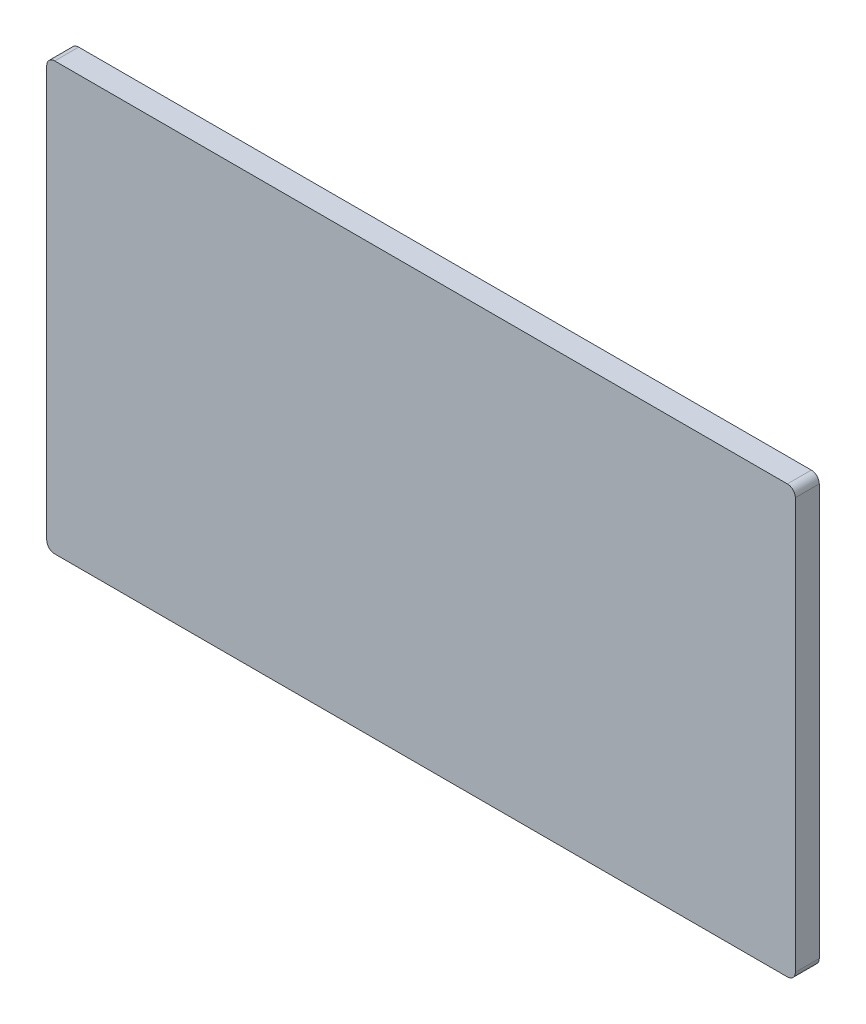
ISO-10303-21;
HEADER;
FILE_DESCRIPTION(('STEP AP214'),'2;1');
FILE_NAME('part.step','',(''),(''),'','','');
FILE_SCHEMA(('AUTOMOTIVE_DESIGN { 1 0 10303 214 1 1 1 1 }'));
ENDSEC;
DATA;
#1=APPLICATION_CONTEXT('core data for automotive mechanical design processes');
#2=APPLICATION_PROTOCOL_DEFINITION('international standard','automotive_design',2000,#1);
#3=PRODUCT_CONTEXT('',#1,'mechanical');
#4=PRODUCT('Part','Part','',(#3));
#5=PRODUCT_RELATED_PRODUCT_CATEGORY('part','',(#4));
#6=PRODUCT_DEFINITION_FORMATION('','',#4);
#7=PRODUCT_DEFINITION_CONTEXT('part definition',#1,'design');
#8=PRODUCT_DEFINITION('design','',#6,#7);
#9=PRODUCT_DEFINITION_SHAPE('','',#8);
#10=(LENGTH_UNIT() NAMED_UNIT(*) SI_UNIT(.MILLI.,.METRE.));
#11=(NAMED_UNIT(*) PLANE_ANGLE_UNIT() SI_UNIT($,.RADIAN.));
#12=(NAMED_UNIT(*) SI_UNIT($,.STERADIAN.) SOLID_ANGLE_UNIT());
#13=UNCERTAINTY_MEASURE_WITH_UNIT(LENGTH_MEASURE(1.E-05),#10,'distance_accuracy_value','');
#14=(GEOMETRIC_REPRESENTATION_CONTEXT(3) GLOBAL_UNCERTAINTY_ASSIGNED_CONTEXT((#13)) GLOBAL_UNIT_ASSIGNED_CONTEXT((#10,
#11,#12)) REPRESENTATION_CONTEXT('',''));
#15=CARTESIAN_POINT('',(0.,0.,0.));
#16=DIRECTION('',(0.,0.,1.));
#17=DIRECTION('',(1.,0.,0.));
#18=AXIS2_PLACEMENT_3D('',#15,#16,#17);
#19=CARTESIAN_POINT('',(46.9,26.75,3.));
#20=DIRECTION('',(-1.,0.,0.));
#21=DIRECTION('',(0.,0.,1.));
#22=AXIS2_PLACEMENT_3D('',#19,#20,#21);
#23=PLANE('',#22);
#24=DIRECTION('',(0.,1.,0.));
#25=VECTOR('',#24,1.);
#26=CARTESIAN_POINT('',(46.9,26.75,3.));
#27=LINE('',#26,#25);
#28=CARTESIAN_POINT('',(46.9,-25.75,3.));
#29=VERTEX_POINT('',#28);
#30=CARTESIAN_POINT('',(46.9,25.75,3.));
#31=VERTEX_POINT('',#30);
#32=EDGE_CURVE('E125',#29,#31,#27,.T.);
#33=ORIENTED_EDGE('',*,*,#32,.F.);
#34=DIRECTION('',(0.,0.,-1.));
#35=VECTOR('',#34,1.);
#36=CARTESIAN_POINT('',(46.9,-25.75,3.));
#37=LINE('',#36,#35);
#38=CARTESIAN_POINT('',(46.9,-25.75,0.));
#39=VERTEX_POINT('',#38);
#40=EDGE_CURVE('E151',#29,#39,#37,.T.);
#41=ORIENTED_EDGE('',*,*,#40,.T.);
#42=DIRECTION('',(0.,1.,0.));
#43=VECTOR('',#42,1.);
#44=CARTESIAN_POINT('',(46.9,26.75,0.));
#45=LINE('',#44,#43);
#46=CARTESIAN_POINT('',(46.9,25.75,0.));
#47=VERTEX_POINT('',#46);
#48=EDGE_CURVE('E157',#39,#47,#45,.T.);
#49=ORIENTED_EDGE('',*,*,#48,.T.);
#50=DIRECTION('',(0.,0.,-1.));
#51=VECTOR('',#50,1.);
#52=CARTESIAN_POINT('',(46.9,25.75,3.));
#53=LINE('',#52,#51);
#54=EDGE_CURVE('E149',#47,#31,#53,.F.);
#55=ORIENTED_EDGE('',*,*,#54,.T.);
#56=EDGE_LOOP('',(#33,#41,#49,#55));
#57=FACE_BOUND('',#56,.T.);
#58=ADVANCED_FACE('F33',(#57),#23,.F.);
#59=CARTESIAN_POINT('',(-46.9,26.75,3.));
#60=DIRECTION('',(0.,-1.,0.));
#61=DIRECTION('',(0.,0.,-1.));
#62=AXIS2_PLACEMENT_3D('',#59,#60,#61);
#63=PLANE('',#62);
#64=DIRECTION('',(-1.,0.,0.));
#65=VECTOR('',#64,1.);
#66=CARTESIAN_POINT('',(-46.9,26.75,3.));
#67=LINE('',#66,#65);
#68=CARTESIAN_POINT('',(45.9,26.75,3.));
#69=VERTEX_POINT('',#68);
#70=CARTESIAN_POINT('',(-45.9,26.75,3.));
#71=VERTEX_POINT('',#70);
#72=EDGE_CURVE('E128',#69,#71,#67,.T.);
#73=ORIENTED_EDGE('',*,*,#72,.F.);
#74=DIRECTION('',(0.,0.,-1.));
#75=VECTOR('',#74,1.);
#76=CARTESIAN_POINT('',(45.9,26.75,3.));
#77=LINE('',#76,#75);
#78=CARTESIAN_POINT('',(45.9,26.75,0.));
#79=VERTEX_POINT('',#78);
#80=EDGE_CURVE('E11',#69,#79,#77,.T.);
#81=ORIENTED_EDGE('',*,*,#80,.T.);
#82=DIRECTION('',(-1.,0.,0.));
#83=VECTOR('',#82,1.);
#84=CARTESIAN_POINT('',(-46.9,26.75,0.));
#85=LINE('',#84,#83);
#86=CARTESIAN_POINT('',(-45.9,26.75,0.));
#87=VERTEX_POINT('',#86);
#88=EDGE_CURVE('E130',#79,#87,#85,.T.);
#89=ORIENTED_EDGE('',*,*,#88,.T.);
#90=DIRECTION('',(0.,0.,-1.));
#91=VECTOR('',#90,1.);
#92=CARTESIAN_POINT('',(-45.9,26.75,3.));
#93=LINE('',#92,#91);
#94=EDGE_CURVE('E41',#87,#71,#93,.F.);
#95=ORIENTED_EDGE('',*,*,#94,.T.);
#96=EDGE_LOOP('',(#73,#81,#89,#95));
#97=FACE_BOUND('',#96,.T.);
#98=ADVANCED_FACE('F176',(#97),#63,.F.);
#99=CARTESIAN_POINT('',(-46.9,26.75,3.));
#100=DIRECTION('',(1.,0.,0.));
#101=DIRECTION('',(0.,0.,-1.));
#102=AXIS2_PLACEMENT_3D('',#99,#100,#101);
#103=PLANE('',#102);
#104=DIRECTION('',(0.,-1.,0.));
#105=VECTOR('',#104,1.);
#106=CARTESIAN_POINT('',(-46.9,26.75,0.));
#107=LINE('',#106,#105);
#108=CARTESIAN_POINT('',(-46.9,25.75,0.));
#109=VERTEX_POINT('',#108);
#110=CARTESIAN_POINT('',(-46.9,-25.75,0.));
#111=VERTEX_POINT('',#110);
#112=EDGE_CURVE('E126',#109,#111,#107,.T.);
#113=ORIENTED_EDGE('',*,*,#112,.T.);
#114=DIRECTION('',(0.,0.,-1.));
#115=VECTOR('',#114,1.);
#116=CARTESIAN_POINT('',(-46.9,-25.75,3.));
#117=LINE('',#116,#115);
#118=CARTESIAN_POINT('',(-46.9,-25.75,3.));
#119=VERTEX_POINT('',#118);
#120=EDGE_CURVE('E104',#111,#119,#117,.F.);
#121=ORIENTED_EDGE('',*,*,#120,.T.);
#122=DIRECTION('',(0.,-1.,0.));
#123=VECTOR('',#122,1.);
#124=CARTESIAN_POINT('',(-46.9,26.75,3.));
#125=LINE('',#124,#123);
#126=CARTESIAN_POINT('',(-46.9,25.75,3.));
#127=VERTEX_POINT('',#126);
#128=EDGE_CURVE('E165',#127,#119,#125,.T.);
#129=ORIENTED_EDGE('',*,*,#128,.F.);
#130=DIRECTION('',(0.,0.,-1.));
#131=VECTOR('',#130,1.);
#132=CARTESIAN_POINT('',(-46.9,25.75,3.));
#133=LINE('',#132,#131);
#134=EDGE_CURVE('E109',#127,#109,#133,.T.);
#135=ORIENTED_EDGE('',*,*,#134,.T.);
#136=EDGE_LOOP('',(#113,#121,#129,#135));
#137=FACE_BOUND('',#136,.T.);
#138=ADVANCED_FACE('F175',(#137),#103,.F.);
#139=CARTESIAN_POINT('',(-46.9,-26.75,3.));
#140=DIRECTION('',(0.,1.,0.));
#141=DIRECTION('',(0.,0.,1.));
#142=AXIS2_PLACEMENT_3D('',#139,#140,#141);
#143=PLANE('',#142);
#144=DIRECTION('',(1.,0.,0.));
#145=VECTOR('',#144,1.);
#146=CARTESIAN_POINT('',(-46.9,-26.75,3.));
#147=LINE('',#146,#145);
#148=CARTESIAN_POINT('',(-45.9,-26.75,3.));
#149=VERTEX_POINT('',#148);
#150=CARTESIAN_POINT('',(45.9,-26.75,3.));
#151=VERTEX_POINT('',#150);
#152=EDGE_CURVE('E119',#149,#151,#147,.T.);
#153=ORIENTED_EDGE('',*,*,#152,.F.);
#154=DIRECTION('',(0.,0.,-1.));
#155=VECTOR('',#154,1.);
#156=CARTESIAN_POINT('',(-45.9,-26.75,3.));
#157=LINE('',#156,#155);
#158=CARTESIAN_POINT('',(-45.9,-26.75,0.));
#159=VERTEX_POINT('',#158);
#160=EDGE_CURVE('E103',#149,#159,#157,.T.);
#161=ORIENTED_EDGE('',*,*,#160,.T.);
#162=DIRECTION('',(1.,0.,0.));
#163=VECTOR('',#162,1.);
#164=CARTESIAN_POINT('',(-46.9,-26.75,0.));
#165=LINE('',#164,#163);
#166=CARTESIAN_POINT('',(45.9,-26.75,0.));
#167=VERTEX_POINT('',#166);
#168=EDGE_CURVE('E116',#159,#167,#165,.T.);
#169=ORIENTED_EDGE('',*,*,#168,.T.);
#170=DIRECTION('',(0.,0.,-1.));
#171=VECTOR('',#170,1.);
#172=CARTESIAN_POINT('',(45.9,-26.75,3.));
#173=LINE('',#172,#171);
#174=EDGE_CURVE('E121',#167,#151,#173,.F.);
#175=ORIENTED_EDGE('',*,*,#174,.T.);
#176=EDGE_LOOP('',(#153,#161,#169,#175));
#177=FACE_BOUND('',#176,.T.);
#178=ADVANCED_FACE('F115',(#177),#143,.F.);
#179=CARTESIAN_POINT('',(0.,0.,3.));
#180=DIRECTION('',(0.,0.,1.));
#181=DIRECTION('',(1.,0.,0.));
#182=AXIS2_PLACEMENT_3D('',#179,#180,#181);
#183=PLANE('',#182);
#184=ORIENTED_EDGE('',*,*,#128,.T.);
#185=CARTESIAN_POINT('',(-45.9,-25.75,3.));
#186=DIRECTION('',(0.,0.,1.));
#187=DIRECTION('',(1.,0.,0.));
#188=AXIS2_PLACEMENT_3D('',#185,#186,#187);
#189=CIRCLE('',#188,1.);
#190=EDGE_CURVE('E147',#119,#149,#189,.T.);
#191=ORIENTED_EDGE('',*,*,#190,.T.);
#192=ORIENTED_EDGE('',*,*,#152,.T.);
#193=CARTESIAN_POINT('',(45.9,-25.75,3.));
#194=DIRECTION('',(0.,0.,1.));
#195=DIRECTION('',(1.,0.,0.));
#196=AXIS2_PLACEMENT_3D('',#193,#194,#195);
#197=CIRCLE('',#196,1.);
#198=EDGE_CURVE('E145',#151,#29,#197,.T.);
#199=ORIENTED_EDGE('',*,*,#198,.T.);
#200=ORIENTED_EDGE('',*,*,#32,.T.);
#201=CARTESIAN_POINT('',(45.9,25.75,3.));
#202=DIRECTION('',(0.,0.,1.));
#203=DIRECTION('',(1.,0.,0.));
#204=AXIS2_PLACEMENT_3D('',#201,#202,#203);
#205=CIRCLE('',#204,1.);
#206=EDGE_CURVE('E54',#31,#69,#205,.T.);
#207=ORIENTED_EDGE('',*,*,#206,.T.);
#208=ORIENTED_EDGE('',*,*,#72,.T.);
#209=CARTESIAN_POINT('',(-45.9,25.75,3.));
#210=DIRECTION('',(0.,0.,1.));
#211=DIRECTION('',(1.,0.,0.));
#212=AXIS2_PLACEMENT_3D('',#209,#210,#211);
#213=CIRCLE('',#212,1.);
#214=EDGE_CURVE('E142',#71,#127,#213,.T.);
#215=ORIENTED_EDGE('',*,*,#214,.T.);
#216=EDGE_LOOP('',(#184,#191,#192,#199,#200,#207,#208,#215));
#217=FACE_BOUND('',#216,.T.);
#218=ADVANCED_FACE('F169',(#217),#183,.T.);
#219=CARTESIAN_POINT('',(0.,0.,0.));
#220=DIRECTION('',(0.,0.,1.));
#221=DIRECTION('',(1.,0.,0.));
#222=AXIS2_PLACEMENT_3D('',#219,#220,#221);
#223=PLANE('',#222);
#224=ORIENTED_EDGE('',*,*,#168,.F.);
#225=CARTESIAN_POINT('',(-45.9,-25.75,0.));
#226=DIRECTION('',(0.,0.,1.));
#227=DIRECTION('',(1.,0.,0.));
#228=AXIS2_PLACEMENT_3D('',#225,#226,#227);
#229=CIRCLE('',#228,1.);
#230=EDGE_CURVE('E99',#159,#111,#229,.F.);
#231=ORIENTED_EDGE('',*,*,#230,.T.);
#232=ORIENTED_EDGE('',*,*,#112,.F.);
#233=CARTESIAN_POINT('',(-45.9,25.75,0.));
#234=DIRECTION('',(0.,0.,1.));
#235=DIRECTION('',(1.,0.,0.));
#236=AXIS2_PLACEMENT_3D('',#233,#234,#235);
#237=CIRCLE('',#236,1.);
#238=EDGE_CURVE('E120',#109,#87,#237,.F.);
#239=ORIENTED_EDGE('',*,*,#238,.T.);
#240=ORIENTED_EDGE('',*,*,#88,.F.);
#241=CARTESIAN_POINT('',(45.9,25.75,0.));
#242=DIRECTION('',(0.,0.,1.));
#243=DIRECTION('',(1.,0.,0.));
#244=AXIS2_PLACEMENT_3D('',#241,#242,#243);
#245=CIRCLE('',#244,1.);
#246=EDGE_CURVE('E136',#79,#47,#245,.F.);
#247=ORIENTED_EDGE('',*,*,#246,.T.);
#248=ORIENTED_EDGE('',*,*,#48,.F.);
#249=CARTESIAN_POINT('',(45.9,-25.75,0.));
#250=DIRECTION('',(0.,0.,1.));
#251=DIRECTION('',(1.,0.,0.));
#252=AXIS2_PLACEMENT_3D('',#249,#250,#251);
#253=CIRCLE('',#252,1.);
#254=EDGE_CURVE('E110',#39,#167,#253,.F.);
#255=ORIENTED_EDGE('',*,*,#254,.T.);
#256=EDGE_LOOP('',(#224,#231,#232,#239,#240,#247,#248,#255));
#257=FACE_BOUND('',#256,.T.);
#258=ADVANCED_FACE('F123',(#257),#223,.F.);
#259=CARTESIAN_POINT('',(-45.9,-25.75,3.));
#260=DIRECTION('',(0.,0.,-1.));
#261=DIRECTION('',(-1.,0.,0.));
#262=AXIS2_PLACEMENT_3D('',#259,#260,#261);
#263=CYLINDRICAL_SURFACE('',#262,1.);
#264=ORIENTED_EDGE('',*,*,#190,.F.);
#265=ORIENTED_EDGE('',*,*,#120,.F.);
#266=ORIENTED_EDGE('',*,*,#230,.F.);
#267=ORIENTED_EDGE('',*,*,#160,.F.);
#268=EDGE_LOOP('',(#264,#265,#266,#267));
#269=FACE_BOUND('',#268,.T.);
#270=ADVANCED_FACE('F102',(#269),#263,.T.);
#271=CARTESIAN_POINT('',(45.9,-25.75,3.));
#272=DIRECTION('',(0.,0.,-1.));
#273=DIRECTION('',(-1.,0.,0.));
#274=AXIS2_PLACEMENT_3D('',#271,#272,#273);
#275=CYLINDRICAL_SURFACE('',#274,1.);
#276=ORIENTED_EDGE('',*,*,#198,.F.);
#277=ORIENTED_EDGE('',*,*,#174,.F.);
#278=ORIENTED_EDGE('',*,*,#254,.F.);
#279=ORIENTED_EDGE('',*,*,#40,.F.);
#280=EDGE_LOOP('',(#276,#277,#278,#279));
#281=FACE_BOUND('',#280,.T.);
#282=ADVANCED_FACE('F179',(#281),#275,.T.);
#283=CARTESIAN_POINT('',(45.9,25.75,3.));
#284=DIRECTION('',(0.,0.,-1.));
#285=DIRECTION('',(-1.,0.,0.));
#286=AXIS2_PLACEMENT_3D('',#283,#284,#285);
#287=CYLINDRICAL_SURFACE('',#286,1.);
#288=ORIENTED_EDGE('',*,*,#206,.F.);
#289=ORIENTED_EDGE('',*,*,#54,.F.);
#290=ORIENTED_EDGE('',*,*,#246,.F.);
#291=ORIENTED_EDGE('',*,*,#80,.F.);
#292=EDGE_LOOP('',(#288,#289,#290,#291));
#293=FACE_BOUND('',#292,.T.);
#294=ADVANCED_FACE('F178',(#293),#287,.T.);
#295=CARTESIAN_POINT('',(-45.9,25.75,3.));
#296=DIRECTION('',(0.,0.,-1.));
#297=DIRECTION('',(-1.,0.,0.));
#298=AXIS2_PLACEMENT_3D('',#295,#296,#297);
#299=CYLINDRICAL_SURFACE('',#298,1.);
#300=ORIENTED_EDGE('',*,*,#214,.F.);
#301=ORIENTED_EDGE('',*,*,#94,.F.);
#302=ORIENTED_EDGE('',*,*,#238,.F.);
#303=ORIENTED_EDGE('',*,*,#134,.F.);
#304=EDGE_LOOP('',(#300,#301,#302,#303));
#305=FACE_BOUND('',#304,.T.);
#306=ADVANCED_FACE('F35',(#305),#299,.T.);
#307=CLOSED_SHELL('',(#58,#98,#138,#178,#218,#258,#270,#282,#294,#306));
#308=MANIFOLD_SOLID_BREP('B2',#307);
#309=ADVANCED_BREP_SHAPE_REPRESENTATION('',(#18,#308),#14);
#310=SHAPE_DEFINITION_REPRESENTATION(#9,#309);
ENDSEC;
END-ISO-10303-21;
